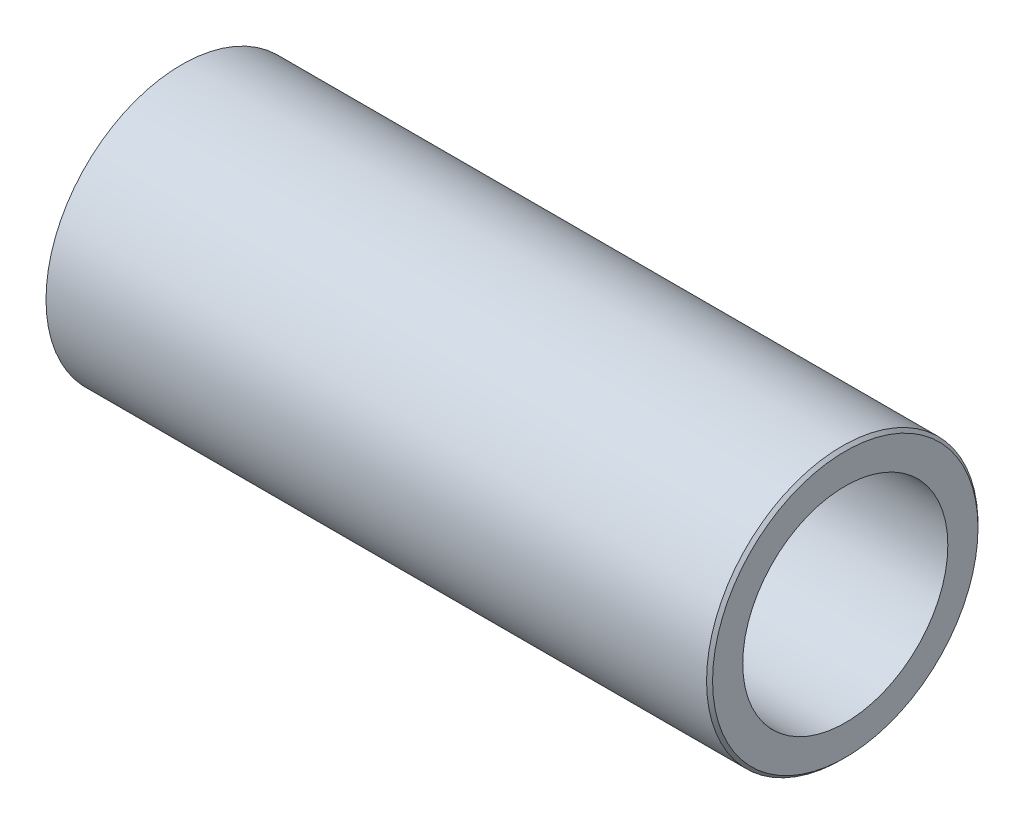
ISO-10303-21;
HEADER;
FILE_DESCRIPTION(('STEP AP214'),'2;1');
FILE_NAME('part.step','',(''),(''),'','','');
FILE_SCHEMA(('AUTOMOTIVE_DESIGN { 1 0 10303 214 1 1 1 1 }'));
ENDSEC;
DATA;
#1=APPLICATION_CONTEXT('core data for automotive mechanical design processes');
#2=APPLICATION_PROTOCOL_DEFINITION('international standard','automotive_design',2000,#1);
#3=PRODUCT_CONTEXT('',#1,'mechanical');
#4=PRODUCT('Part','Part','',(#3));
#5=PRODUCT_RELATED_PRODUCT_CATEGORY('part','',(#4));
#6=PRODUCT_DEFINITION_FORMATION('','',#4);
#7=PRODUCT_DEFINITION_CONTEXT('part definition',#1,'design');
#8=PRODUCT_DEFINITION('design','',#6,#7);
#9=PRODUCT_DEFINITION_SHAPE('','',#8);
#10=(LENGTH_UNIT() NAMED_UNIT(*) SI_UNIT(.MILLI.,.METRE.));
#11=(NAMED_UNIT(*) PLANE_ANGLE_UNIT() SI_UNIT($,.RADIAN.));
#12=(NAMED_UNIT(*) SI_UNIT($,.STERADIAN.) SOLID_ANGLE_UNIT());
#13=UNCERTAINTY_MEASURE_WITH_UNIT(LENGTH_MEASURE(1.E-05),#10,'distance_accuracy_value','');
#14=(GEOMETRIC_REPRESENTATION_CONTEXT(3) GLOBAL_UNCERTAINTY_ASSIGNED_CONTEXT((#13)) GLOBAL_UNIT_ASSIGNED_CONTEXT((#10,
#11,#12)) REPRESENTATION_CONTEXT('',''));
#15=CARTESIAN_POINT('',(0.,0.,0.));
#16=DIRECTION('',(0.,0.,1.));
#17=DIRECTION('',(1.,0.,0.));
#18=AXIS2_PLACEMENT_3D('',#15,#16,#17);
#19=CARTESIAN_POINT('',(-14.4,0.,0.));
#20=DIRECTION('',(-1.,0.,0.));
#21=DIRECTION('',(0.,0.,1.));
#22=AXIS2_PLACEMENT_3D('',#19,#20,#21);
#23=CYLINDRICAL_SURFACE('',#22,12.);
#24=CARTESIAN_POINT('',(0.,0.,0.));
#25=DIRECTION('',(-1.,0.,0.));
#26=DIRECTION('',(0.,0.,1.));
#27=AXIS2_PLACEMENT_3D('',#24,#25,#26);
#28=CIRCLE('',#27,12.);
#29=CARTESIAN_POINT('',(0.,0.,12.));
#30=VERTEX_POINT('',#29);
#31=EDGE_CURVE('E59',#30,#30,#28,.T.);
#32=ORIENTED_EDGE('',*,*,#31,.F.);
#33=EDGE_LOOP('',(#32));
#34=FACE_BOUND('',#33,.T.);
#35=CARTESIAN_POINT('',(-60.,0.,0.));
#36=DIRECTION('',(-1.,0.,0.));
#37=DIRECTION('',(0.,0.,1.));
#38=AXIS2_PLACEMENT_3D('',#35,#36,#37);
#39=CIRCLE('',#38,12.);
#40=CARTESIAN_POINT('',(-60.,0.,12.));
#41=VERTEX_POINT('',#40);
#42=EDGE_CURVE('E86',#41,#41,#39,.T.);
#43=ORIENTED_EDGE('',*,*,#42,.T.);
#44=EDGE_LOOP('',(#43));
#45=FACE_BOUND('',#44,.T.);
#46=ADVANCED_FACE('F45',(#34,#45),#23,.F.);
#47=CARTESIAN_POINT('',(0.,12.,0.));
#48=DIRECTION('',(-1.,0.,0.));
#49=DIRECTION('',(0.,0.,1.));
#50=AXIS2_PLACEMENT_3D('',#47,#48,#49);
#51=PLANE('',#50);
#52=CARTESIAN_POINT('',(0.,0.,0.));
#53=DIRECTION('',(-1.,0.,0.));
#54=DIRECTION('',(0.,0.,1.));
#55=AXIS2_PLACEMENT_3D('',#52,#53,#54);
#56=CIRCLE('',#55,17.);
#57=CARTESIAN_POINT('',(0.,0.,17.));
#58=VERTEX_POINT('',#57);
#59=EDGE_CURVE('E64',#58,#58,#56,.T.);
#60=ORIENTED_EDGE('',*,*,#59,.F.);
#61=EDGE_LOOP('',(#60));
#62=FACE_BOUND('',#61,.T.);
#63=ORIENTED_EDGE('',*,*,#31,.T.);
#64=EDGE_LOOP('',(#63));
#65=FACE_BOUND('',#64,.T.);
#66=ADVANCED_FACE('F121',(#62,#65),#51,.F.);
#67=CARTESIAN_POINT('',(-14.4,0.,0.));
#68=DIRECTION('',(-1.,0.,0.));
#69=DIRECTION('',(0.,0.,1.));
#70=AXIS2_PLACEMENT_3D('',#67,#68,#69);
#71=CYLINDRICAL_SURFACE('',#70,17.);
#72=CARTESIAN_POINT('',(46.,0.,0.));
#73=DIRECTION('',(-1.,0.,0.));
#74=DIRECTION('',(0.,0.,1.));
#75=AXIS2_PLACEMENT_3D('',#72,#73,#74);
#76=CIRCLE('',#75,17.);
#77=CARTESIAN_POINT('',(46.,0.,17.));
#78=VERTEX_POINT('',#77);
#79=EDGE_CURVE('E70',#78,#78,#76,.T.);
#80=ORIENTED_EDGE('',*,*,#79,.F.);
#81=EDGE_LOOP('',(#80));
#82=FACE_BOUND('',#81,.T.);
#83=ORIENTED_EDGE('',*,*,#59,.T.);
#84=EDGE_LOOP('',(#83));
#85=FACE_BOUND('',#84,.T.);
#86=ADVANCED_FACE('F118',(#82,#85),#71,.F.);
#87=CARTESIAN_POINT('',(46.,17.,0.));
#88=DIRECTION('',(-1.,0.,0.));
#89=DIRECTION('',(0.,0.,1.));
#90=AXIS2_PLACEMENT_3D('',#87,#88,#89);
#91=PLANE('',#90);
#92=CARTESIAN_POINT('',(46.,0.,0.));
#93=DIRECTION('',(-1.,0.,0.));
#94=DIRECTION('',(0.,0.,1.));
#95=AXIS2_PLACEMENT_3D('',#92,#93,#94);
#96=CIRCLE('',#95,22.);
#97=CARTESIAN_POINT('',(46.,0.,22.));
#98=VERTEX_POINT('',#97);
#99=EDGE_CURVE('E10',#98,#98,#96,.F.);
#100=ORIENTED_EDGE('',*,*,#99,.T.);
#101=EDGE_LOOP('',(#100));
#102=FACE_BOUND('',#101,.T.);
#103=ORIENTED_EDGE('',*,*,#79,.T.);
#104=EDGE_LOOP('',(#103));
#105=FACE_BOUND('',#104,.T.);
#106=ADVANCED_FACE('F112',(#102,#105),#91,.F.);
#107=CARTESIAN_POINT('',(-14.4,0.,0.));
#108=DIRECTION('',(-1.,0.,0.));
#109=DIRECTION('',(0.,0.,1.));
#110=AXIS2_PLACEMENT_3D('',#107,#108,#109);
#111=CYLINDRICAL_SURFACE('',#110,22.5);
#112=CARTESIAN_POINT('',(45.5,0.,0.));
#113=DIRECTION('',(-1.,0.,0.));
#114=DIRECTION('',(0.,0.,1.));
#115=AXIS2_PLACEMENT_3D('',#112,#113,#114);
#116=CIRCLE('',#115,22.5);
#117=CARTESIAN_POINT('',(45.5,0.,22.5));
#118=VERTEX_POINT('',#117);
#119=EDGE_CURVE('E54',#118,#118,#116,.T.);
#120=ORIENTED_EDGE('',*,*,#119,.T.);
#121=EDGE_LOOP('',(#120));
#122=FACE_BOUND('',#121,.T.);
#123=CARTESIAN_POINT('',(-64.,0.,0.));
#124=DIRECTION('',(-1.,0.,0.));
#125=DIRECTION('',(0.,0.,1.));
#126=AXIS2_PLACEMENT_3D('',#123,#124,#125);
#127=CIRCLE('',#126,22.5);
#128=CARTESIAN_POINT('',(-64.,0.,22.5));
#129=VERTEX_POINT('',#128);
#130=EDGE_CURVE('E74',#129,#129,#127,.T.);
#131=ORIENTED_EDGE('',*,*,#130,.F.);
#132=EDGE_LOOP('',(#131));
#133=FACE_BOUND('',#132,.T.);
#134=ADVANCED_FACE('F107',(#122,#133),#111,.T.);
#135=CARTESIAN_POINT('',(-64.,22.5,0.));
#136=DIRECTION('',(1.,0.,0.));
#137=DIRECTION('',(0.,0.,-1.));
#138=AXIS2_PLACEMENT_3D('',#135,#136,#137);
#139=PLANE('',#138);
#140=CARTESIAN_POINT('',(-64.,0.,0.));
#141=DIRECTION('',(-1.,0.,0.));
#142=DIRECTION('',(0.,0.,1.));
#143=AXIS2_PLACEMENT_3D('',#140,#141,#142);
#144=CIRCLE('',#143,9.);
#145=CARTESIAN_POINT('',(-64.,0.,9.));
#146=VERTEX_POINT('',#145);
#147=EDGE_CURVE('E78',#146,#146,#144,.T.);
#148=ORIENTED_EDGE('',*,*,#147,.F.);
#149=EDGE_LOOP('',(#148));
#150=FACE_BOUND('',#149,.T.);
#151=ORIENTED_EDGE('',*,*,#130,.T.);
#152=EDGE_LOOP('',(#151));
#153=FACE_BOUND('',#152,.T.);
#154=ADVANCED_FACE('F101',(#150,#153),#139,.F.);
#155=CARTESIAN_POINT('',(-14.4,0.,0.));
#156=DIRECTION('',(-1.,0.,0.));
#157=DIRECTION('',(0.,0.,1.));
#158=AXIS2_PLACEMENT_3D('',#155,#156,#157);
#159=CYLINDRICAL_SURFACE('',#158,9.);
#160=CARTESIAN_POINT('',(-60.,0.,0.));
#161=DIRECTION('',(-1.,0.,0.));
#162=DIRECTION('',(0.,0.,1.));
#163=AXIS2_PLACEMENT_3D('',#160,#161,#162);
#164=CIRCLE('',#163,9.);
#165=CARTESIAN_POINT('',(-60.,0.,9.));
#166=VERTEX_POINT('',#165);
#167=EDGE_CURVE('E82',#166,#166,#164,.T.);
#168=ORIENTED_EDGE('',*,*,#167,.F.);
#169=EDGE_LOOP('',(#168));
#170=FACE_BOUND('',#169,.T.);
#171=ORIENTED_EDGE('',*,*,#147,.T.);
#172=EDGE_LOOP('',(#171));
#173=FACE_BOUND('',#172,.T.);
#174=ADVANCED_FACE('F95',(#170,#173),#159,.F.);
#175=CARTESIAN_POINT('',(-60.,9.,0.));
#176=DIRECTION('',(-1.,0.,0.));
#177=DIRECTION('',(0.,0.,1.));
#178=AXIS2_PLACEMENT_3D('',#175,#176,#177);
#179=PLANE('',#178);
#180=ORIENTED_EDGE('',*,*,#42,.F.);
#181=EDGE_LOOP('',(#180));
#182=FACE_BOUND('',#181,.T.);
#183=ORIENTED_EDGE('',*,*,#167,.T.);
#184=EDGE_LOOP('',(#183));
#185=FACE_BOUND('',#184,.T.);
#186=ADVANCED_FACE('F92',(#182,#185),#179,.F.);
#187=CARTESIAN_POINT('',(45.5,0.,0.));
#188=DIRECTION('',(-1.,0.,0.));
#189=DIRECTION('',(0.,0.,1.));
#190=AXIS2_PLACEMENT_3D('',#187,#188,#189);
#191=CONICAL_SURFACE('',#190,22.5,0.785398163397428);
#192=ORIENTED_EDGE('',*,*,#99,.F.);
#193=EDGE_LOOP('',(#192));
#194=FACE_BOUND('',#193,.T.);
#195=ORIENTED_EDGE('',*,*,#119,.F.);
#196=EDGE_LOOP('',(#195));
#197=FACE_BOUND('',#196,.T.);
#198=ADVANCED_FACE('F48',(#194,#197),#191,.T.);
#199=CLOSED_SHELL('',(#46,#66,#86,#106,#134,#154,#174,#186,#198));
#200=MANIFOLD_SOLID_BREP('B2',#199);
#201=ADVANCED_BREP_SHAPE_REPRESENTATION('',(#18,#200),#14);
#202=SHAPE_DEFINITION_REPRESENTATION(#9,#201);
ENDSEC;
END-ISO-10303-21;
